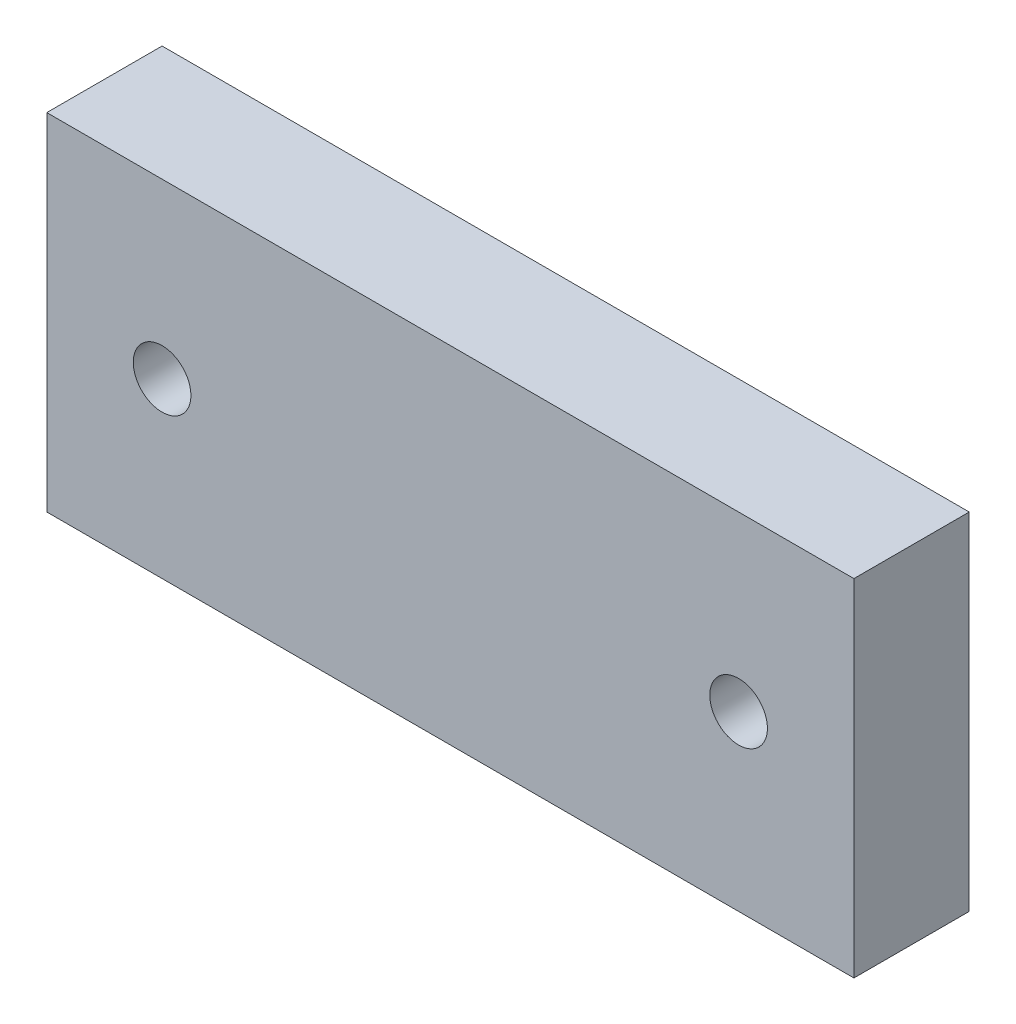
ISO-10303-21;
HEADER;
FILE_DESCRIPTION(('STEP AP214'),'2;1');
FILE_NAME('part.step','',(''),(''),'','','');
FILE_SCHEMA(('AUTOMOTIVE_DESIGN { 1 0 10303 214 1 1 1 1 }'));
ENDSEC;
DATA;
#1=APPLICATION_CONTEXT('core data for automotive mechanical design processes');
#2=APPLICATION_PROTOCOL_DEFINITION('international standard','automotive_design',2000,#1);
#3=PRODUCT_CONTEXT('',#1,'mechanical');
#4=PRODUCT('Part','Part','',(#3));
#5=PRODUCT_RELATED_PRODUCT_CATEGORY('part','',(#4));
#6=PRODUCT_DEFINITION_FORMATION('','',#4);
#7=PRODUCT_DEFINITION_CONTEXT('part definition',#1,'design');
#8=PRODUCT_DEFINITION('design','',#6,#7);
#9=PRODUCT_DEFINITION_SHAPE('','',#8);
#10=(LENGTH_UNIT() NAMED_UNIT(*) SI_UNIT(.MILLI.,.METRE.));
#11=(NAMED_UNIT(*) PLANE_ANGLE_UNIT() SI_UNIT($,.RADIAN.));
#12=(NAMED_UNIT(*) SI_UNIT($,.STERADIAN.) SOLID_ANGLE_UNIT());
#13=UNCERTAINTY_MEASURE_WITH_UNIT(LENGTH_MEASURE(1.E-05),#10,'distance_accuracy_value','');
#14=(GEOMETRIC_REPRESENTATION_CONTEXT(3) GLOBAL_UNCERTAINTY_ASSIGNED_CONTEXT((#13)) GLOBAL_UNIT_ASSIGNED_CONTEXT((#10,
#11,#12)) REPRESENTATION_CONTEXT('',''));
#15=CARTESIAN_POINT('',(0.,0.,0.));
#16=DIRECTION('',(0.,0.,1.));
#17=DIRECTION('',(1.,0.,0.));
#18=AXIS2_PLACEMENT_3D('',#15,#16,#17);
#19=CARTESIAN_POINT('',(-30.4122255040452,13.3566433566434,4.));
#20=DIRECTION('',(1.,0.,0.));
#21=DIRECTION('',(0.,0.,-1.));
#22=AXIS2_PLACEMENT_3D('',#19,#20,#21);
#23=PLANE('',#22);
#24=DIRECTION('',(0.,-1.,0.));
#25=VECTOR('',#24,1.);
#26=CARTESIAN_POINT('',(-30.4122255040452,13.3566433566434,0.));
#27=LINE('',#26,#25);
#28=CARTESIAN_POINT('',(-30.4122255040452,13.3566433566434,0.));
#29=VERTEX_POINT('',#28);
#30=CARTESIAN_POINT('',(-30.4122255040452,1.35664335664336,0.));
#31=VERTEX_POINT('',#30);
#32=EDGE_CURVE('E96',#29,#31,#27,.T.);
#33=ORIENTED_EDGE('',*,*,#32,.T.);
#34=DIRECTION('',(0.,0.,-1.));
#35=VECTOR('',#34,1.);
#36=CARTESIAN_POINT('',(-30.4122255040452,1.35664335664336,4.));
#37=LINE('',#36,#35);
#38=CARTESIAN_POINT('',(-30.4122255040452,1.35664335664336,4.));
#39=VERTEX_POINT('',#38);
#40=EDGE_CURVE('E11',#39,#31,#37,.T.);
#41=ORIENTED_EDGE('',*,*,#40,.F.);
#42=DIRECTION('',(0.,-1.,0.));
#43=VECTOR('',#42,1.);
#44=CARTESIAN_POINT('',(-30.4122255040452,13.3566433566434,4.));
#45=LINE('',#44,#43);
#46=CARTESIAN_POINT('',(-30.4122255040452,13.3566433566434,4.));
#47=VERTEX_POINT('',#46);
#48=EDGE_CURVE('E84',#47,#39,#45,.T.);
#49=ORIENTED_EDGE('',*,*,#48,.F.);
#50=DIRECTION('',(0.,0.,-1.));
#51=VECTOR('',#50,1.);
#52=CARTESIAN_POINT('',(-30.4122255040452,13.3566433566434,4.));
#53=LINE('',#52,#51);
#54=EDGE_CURVE('E92',#47,#29,#53,.T.);
#55=ORIENTED_EDGE('',*,*,#54,.T.);
#56=EDGE_LOOP('',(#33,#41,#49,#55));
#57=FACE_BOUND('',#56,.T.);
#58=ADVANCED_FACE('F33',(#57),#23,.F.);
#59=CARTESIAN_POINT('',(-30.4122255040452,1.35664335664336,4.));
#60=DIRECTION('',(0.,1.,0.));
#61=DIRECTION('',(0.,0.,1.));
#62=AXIS2_PLACEMENT_3D('',#59,#60,#61);
#63=PLANE('',#62);
#64=DIRECTION('',(1.,0.,0.));
#65=VECTOR('',#64,1.);
#66=CARTESIAN_POINT('',(-30.4122255040452,1.35664335664336,0.));
#67=LINE('',#66,#65);
#68=CARTESIAN_POINT('',(-2.41222550404521,1.35664335664336,0.));
#69=VERTEX_POINT('',#68);
#70=EDGE_CURVE('E88',#31,#69,#67,.T.);
#71=ORIENTED_EDGE('',*,*,#70,.T.);
#72=DIRECTION('',(0.,0.,-1.));
#73=VECTOR('',#72,1.);
#74=CARTESIAN_POINT('',(-2.41222550404521,1.35664335664336,4.));
#75=LINE('',#74,#73);
#76=CARTESIAN_POINT('',(-2.41222550404521,1.35664335664336,4.));
#77=VERTEX_POINT('',#76);
#78=EDGE_CURVE('E41',#77,#69,#75,.T.);
#79=ORIENTED_EDGE('',*,*,#78,.F.);
#80=DIRECTION('',(1.,0.,0.));
#81=VECTOR('',#80,1.);
#82=CARTESIAN_POINT('',(-30.4122255040452,1.35664335664336,4.));
#83=LINE('',#82,#81);
#84=EDGE_CURVE('E79',#39,#77,#83,.T.);
#85=ORIENTED_EDGE('',*,*,#84,.F.);
#86=ORIENTED_EDGE('',*,*,#40,.T.);
#87=EDGE_LOOP('',(#71,#79,#85,#86));
#88=FACE_BOUND('',#87,.T.);
#89=ADVANCED_FACE('F87',(#88),#63,.F.);
#90=CARTESIAN_POINT('',(-2.41222550404521,13.3566433566434,4.));
#91=DIRECTION('',(-1.,0.,0.));
#92=DIRECTION('',(0.,0.,1.));
#93=AXIS2_PLACEMENT_3D('',#90,#91,#92);
#94=PLANE('',#93);
#95=DIRECTION('',(0.,1.,0.));
#96=VECTOR('',#95,1.);
#97=CARTESIAN_POINT('',(-2.41222550404521,13.3566433566434,0.));
#98=LINE('',#97,#96);
#99=CARTESIAN_POINT('',(-2.41222550404521,13.3566433566434,0.));
#100=VERTEX_POINT('',#99);
#101=EDGE_CURVE('E66',#69,#100,#98,.T.);
#102=ORIENTED_EDGE('',*,*,#101,.T.);
#103=DIRECTION('',(0.,0.,-1.));
#104=VECTOR('',#103,1.);
#105=CARTESIAN_POINT('',(-2.41222550404521,13.3566433566434,4.));
#106=LINE('',#105,#104);
#107=CARTESIAN_POINT('',(-2.41222550404521,13.3566433566434,4.));
#108=VERTEX_POINT('',#107);
#109=EDGE_CURVE('E89',#108,#100,#106,.T.);
#110=ORIENTED_EDGE('',*,*,#109,.F.);
#111=DIRECTION('',(0.,1.,0.));
#112=VECTOR('',#111,1.);
#113=CARTESIAN_POINT('',(-2.41222550404521,13.3566433566434,4.));
#114=LINE('',#113,#112);
#115=EDGE_CURVE('E82',#77,#108,#114,.T.);
#116=ORIENTED_EDGE('',*,*,#115,.F.);
#117=ORIENTED_EDGE('',*,*,#78,.T.);
#118=EDGE_LOOP('',(#102,#110,#116,#117));
#119=FACE_BOUND('',#118,.T.);
#120=ADVANCED_FACE('F90',(#119),#94,.F.);
#121=CARTESIAN_POINT('',(-30.4122255040452,13.3566433566434,4.));
#122=DIRECTION('',(0.,-1.,0.));
#123=DIRECTION('',(0.,0.,-1.));
#124=AXIS2_PLACEMENT_3D('',#121,#122,#123);
#125=PLANE('',#124);
#126=DIRECTION('',(-1.,0.,0.));
#127=VECTOR('',#126,1.);
#128=CARTESIAN_POINT('',(-30.4122255040452,13.3566433566434,0.));
#129=LINE('',#128,#127);
#130=EDGE_CURVE('E72',#100,#29,#129,.T.);
#131=ORIENTED_EDGE('',*,*,#130,.T.);
#132=ORIENTED_EDGE('',*,*,#54,.F.);
#133=DIRECTION('',(-1.,0.,0.));
#134=VECTOR('',#133,1.);
#135=CARTESIAN_POINT('',(-30.4122255040452,13.3566433566434,4.));
#136=LINE('',#135,#134);
#137=EDGE_CURVE('E49',#108,#47,#136,.T.);
#138=ORIENTED_EDGE('',*,*,#137,.F.);
#139=ORIENTED_EDGE('',*,*,#109,.T.);
#140=EDGE_LOOP('',(#131,#132,#138,#139));
#141=FACE_BOUND('',#140,.T.);
#142=ADVANCED_FACE('F104',(#141),#125,.F.);
#143=CARTESIAN_POINT('',(0.,0.,4.));
#144=DIRECTION('',(0.,0.,1.));
#145=DIRECTION('',(1.,0.,0.));
#146=AXIS2_PLACEMENT_3D('',#143,#144,#145);
#147=PLANE('',#146);
#148=CARTESIAN_POINT('',(-6.41222550404521,7.35664335664336,4.));
#149=DIRECTION('',(0.,0.,1.));
#150=DIRECTION('',(1.,0.,0.));
#151=AXIS2_PLACEMENT_3D('',#148,#149,#150);
#152=CIRCLE('',#151,1.);
#153=CARTESIAN_POINT('',(-5.41222550404521,7.35664335664336,4.));
#154=VERTEX_POINT('',#153);
#155=EDGE_CURVE('E116',#154,#154,#152,.T.);
#156=ORIENTED_EDGE('',*,*,#155,.F.);
#157=EDGE_LOOP('',(#156));
#158=FACE_BOUND('',#157,.T.);
#159=CARTESIAN_POINT('',(-26.4122255040452,7.35664335664336,4.));
#160=DIRECTION('',(0.,0.,1.));
#161=DIRECTION('',(1.,0.,0.));
#162=AXIS2_PLACEMENT_3D('',#159,#160,#161);
#163=CIRCLE('',#162,1.);
#164=CARTESIAN_POINT('',(-25.4122255040452,7.35664335664336,4.));
#165=VERTEX_POINT('',#164);
#166=EDGE_CURVE('E110',#165,#165,#163,.T.);
#167=ORIENTED_EDGE('',*,*,#166,.F.);
#168=EDGE_LOOP('',(#167));
#169=FACE_BOUND('',#168,.T.);
#170=ORIENTED_EDGE('',*,*,#48,.T.);
#171=ORIENTED_EDGE('',*,*,#84,.T.);
#172=ORIENTED_EDGE('',*,*,#115,.T.);
#173=ORIENTED_EDGE('',*,*,#137,.T.);
#174=EDGE_LOOP('',(#170,#171,#172,#173));
#175=FACE_BOUND('',#174,.T.);
#176=ADVANCED_FACE('F80',(#158,#169,#175),#147,.T.);
#177=CARTESIAN_POINT('',(0.,0.,0.));
#178=DIRECTION('',(0.,0.,1.));
#179=DIRECTION('',(1.,0.,0.));
#180=AXIS2_PLACEMENT_3D('',#177,#178,#179);
#181=PLANE('',#180);
#182=CARTESIAN_POINT('',(-6.41222550404521,7.35664335664336,0.));
#183=DIRECTION('',(0.,0.,1.));
#184=DIRECTION('',(1.,0.,0.));
#185=AXIS2_PLACEMENT_3D('',#182,#183,#184);
#186=CIRCLE('',#185,1.);
#187=CARTESIAN_POINT('',(-5.41222550404521,7.35664335664336,0.));
#188=VERTEX_POINT('',#187);
#189=EDGE_CURVE('E113',#188,#188,#186,.T.);
#190=ORIENTED_EDGE('',*,*,#189,.T.);
#191=EDGE_LOOP('',(#190));
#192=FACE_BOUND('',#191,.T.);
#193=CARTESIAN_POINT('',(-26.4122255040452,7.35664335664336,0.));
#194=DIRECTION('',(0.,0.,1.));
#195=DIRECTION('',(1.,0.,0.));
#196=AXIS2_PLACEMENT_3D('',#193,#194,#195);
#197=CIRCLE('',#196,1.);
#198=CARTESIAN_POINT('',(-25.4122255040452,7.35664335664336,0.));
#199=VERTEX_POINT('',#198);
#200=EDGE_CURVE('E99',#199,#199,#197,.T.);
#201=ORIENTED_EDGE('',*,*,#200,.T.);
#202=EDGE_LOOP('',(#201));
#203=FACE_BOUND('',#202,.T.);
#204=ORIENTED_EDGE('',*,*,#32,.F.);
#205=ORIENTED_EDGE('',*,*,#130,.F.);
#206=ORIENTED_EDGE('',*,*,#101,.F.);
#207=ORIENTED_EDGE('',*,*,#70,.F.);
#208=EDGE_LOOP('',(#204,#205,#206,#207));
#209=FACE_BOUND('',#208,.T.);
#210=ADVANCED_FACE('F107',(#192,#203,#209),#181,.F.);
#211=CARTESIAN_POINT('',(-26.4122255040452,7.35664335664336,0.));
#212=DIRECTION('',(0.,0.,1.));
#213=DIRECTION('',(1.,0.,0.));
#214=AXIS2_PLACEMENT_3D('',#211,#212,#213);
#215=CYLINDRICAL_SURFACE('',#214,1.);
#216=ORIENTED_EDGE('',*,*,#200,.F.);
#217=EDGE_LOOP('',(#216));
#218=FACE_BOUND('',#217,.T.);
#219=ORIENTED_EDGE('',*,*,#166,.T.);
#220=EDGE_LOOP('',(#219));
#221=FACE_BOUND('',#220,.T.);
#222=ADVANCED_FACE('F127',(#218,#221),#215,.F.);
#223=CARTESIAN_POINT('',(-6.41222550404521,7.35664335664336,0.));
#224=DIRECTION('',(0.,0.,1.));
#225=DIRECTION('',(1.,0.,0.));
#226=AXIS2_PLACEMENT_3D('',#223,#224,#225);
#227=CYLINDRICAL_SURFACE('',#226,1.);
#228=ORIENTED_EDGE('',*,*,#189,.F.);
#229=EDGE_LOOP('',(#228));
#230=FACE_BOUND('',#229,.T.);
#231=ORIENTED_EDGE('',*,*,#155,.T.);
#232=EDGE_LOOP('',(#231));
#233=FACE_BOUND('',#232,.T.);
#234=ADVANCED_FACE('F124',(#230,#233),#227,.F.);
#235=CLOSED_SHELL('',(#58,#89,#120,#142,#176,#210,#222,#234));
#236=MANIFOLD_SOLID_BREP('B2',#235);
#237=ADVANCED_BREP_SHAPE_REPRESENTATION('',(#18,#236),#14);
#238=SHAPE_DEFINITION_REPRESENTATION(#9,#237);
ENDSEC;
END-ISO-10303-21;
